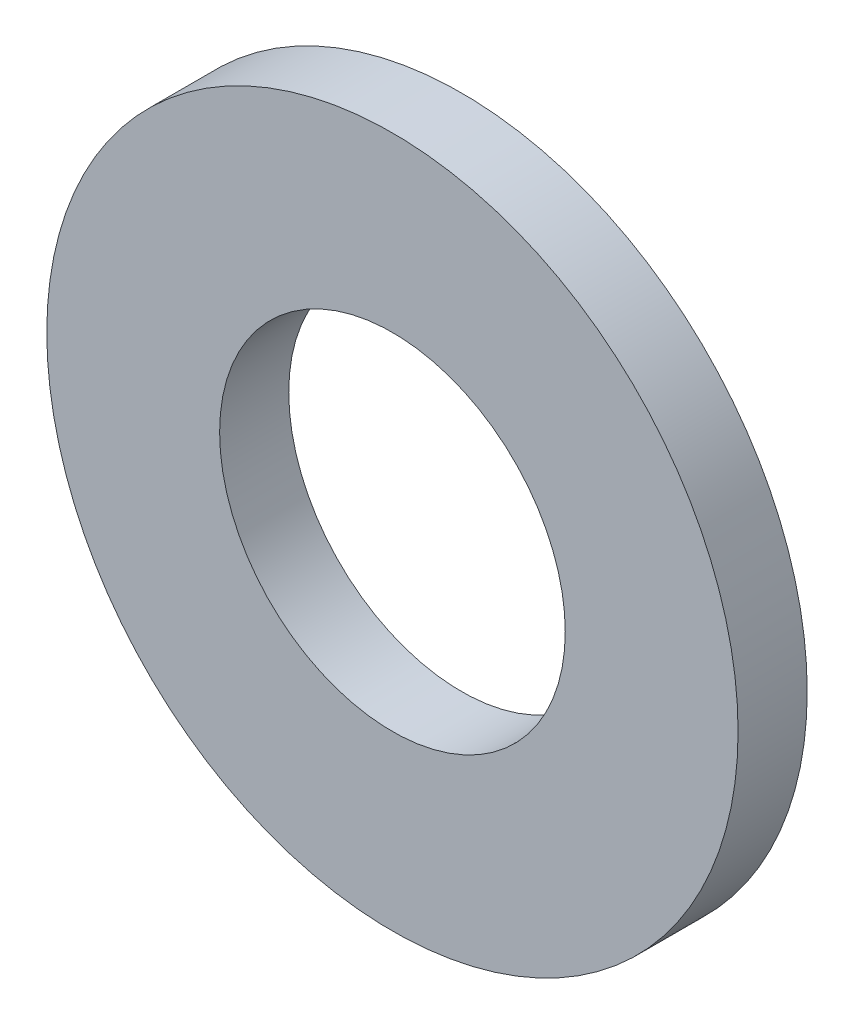
ISO-10303-21;
HEADER;
FILE_DESCRIPTION(('STEP AP214'),'2;1');
FILE_NAME('part.step','',(''),(''),'','','');
FILE_SCHEMA(('AUTOMOTIVE_DESIGN { 1 0 10303 214 1 1 1 1 }'));
ENDSEC;
DATA;
#1=APPLICATION_CONTEXT('core data for automotive mechanical design processes');
#2=APPLICATION_PROTOCOL_DEFINITION('international standard','automotive_design',2000,#1);
#3=PRODUCT_CONTEXT('',#1,'mechanical');
#4=PRODUCT('Part','Part','',(#3));
#5=PRODUCT_RELATED_PRODUCT_CATEGORY('part','',(#4));
#6=PRODUCT_DEFINITION_FORMATION('','',#4);
#7=PRODUCT_DEFINITION_CONTEXT('part definition',#1,'design');
#8=PRODUCT_DEFINITION('design','',#6,#7);
#9=PRODUCT_DEFINITION_SHAPE('','',#8);
#10=(LENGTH_UNIT() NAMED_UNIT(*) SI_UNIT(.MILLI.,.METRE.));
#11=(NAMED_UNIT(*) PLANE_ANGLE_UNIT() SI_UNIT($,.RADIAN.));
#12=(NAMED_UNIT(*) SI_UNIT($,.STERADIAN.) SOLID_ANGLE_UNIT());
#13=UNCERTAINTY_MEASURE_WITH_UNIT(LENGTH_MEASURE(1.E-05),#10,'distance_accuracy_value','');
#14=(GEOMETRIC_REPRESENTATION_CONTEXT(3) GLOBAL_UNCERTAINTY_ASSIGNED_CONTEXT((#13)) GLOBAL_UNIT_ASSIGNED_CONTEXT((#10,
#11,#12)) REPRESENTATION_CONTEXT('',''));
#15=CARTESIAN_POINT('',(0.,0.,0.));
#16=DIRECTION('',(0.,0.,1.));
#17=DIRECTION('',(1.,0.,0.));
#18=AXIS2_PLACEMENT_3D('',#15,#16,#17);
#19=CARTESIAN_POINT('',(0.,0.,1.6));
#20=DIRECTION('',(0.,0.,1.));
#21=DIRECTION('',(1.,0.,0.));
#22=AXIS2_PLACEMENT_3D('',#19,#20,#21);
#23=PLANE('',#22);
#24=CARTESIAN_POINT('',(0.,0.,1.6));
#25=DIRECTION('',(0.,0.,1.));
#26=DIRECTION('',(1.,0.,0.));
#27=AXIS2_PLACEMENT_3D('',#24,#25,#26);
#28=CIRCLE('',#27,8.);
#29=CARTESIAN_POINT('',(8.,0.,1.6));
#30=VERTEX_POINT('',#29);
#31=EDGE_CURVE('E10',#30,#30,#28,.T.);
#32=ORIENTED_EDGE('',*,*,#31,.T.);
#33=EDGE_LOOP('',(#32));
#34=FACE_BOUND('',#33,.T.);
#35=CARTESIAN_POINT('',(0.,0.,1.6));
#36=DIRECTION('',(0.,0.,1.));
#37=DIRECTION('',(1.,0.,0.));
#38=AXIS2_PLACEMENT_3D('',#35,#36,#37);
#39=CIRCLE('',#38,4.);
#40=CARTESIAN_POINT('',(4.,0.,1.6));
#41=VERTEX_POINT('',#40);
#42=EDGE_CURVE('E42',#41,#41,#39,.T.);
#43=ORIENTED_EDGE('',*,*,#42,.F.);
#44=EDGE_LOOP('',(#43));
#45=FACE_BOUND('',#44,.T.);
#46=ADVANCED_FACE('F31',(#34,#45),#23,.T.);
#47=CARTESIAN_POINT('',(0.,0.,0.));
#48=DIRECTION('',(0.,0.,1.));
#49=DIRECTION('',(1.,0.,0.));
#50=AXIS2_PLACEMENT_3D('',#47,#48,#49);
#51=PLANE('',#50);
#52=CARTESIAN_POINT('',(0.,0.,0.));
#53=DIRECTION('',(0.,0.,1.));
#54=DIRECTION('',(1.,0.,0.));
#55=AXIS2_PLACEMENT_3D('',#52,#53,#54);
#56=CIRCLE('',#55,8.);
#57=CARTESIAN_POINT('',(8.,0.,0.));
#58=VERTEX_POINT('',#57);
#59=EDGE_CURVE('E35',#58,#58,#56,.T.);
#60=ORIENTED_EDGE('',*,*,#59,.F.);
#61=EDGE_LOOP('',(#60));
#62=FACE_BOUND('',#61,.T.);
#63=CARTESIAN_POINT('',(0.,0.,0.));
#64=DIRECTION('',(0.,0.,1.));
#65=DIRECTION('',(1.,0.,0.));
#66=AXIS2_PLACEMENT_3D('',#63,#64,#65);
#67=CIRCLE('',#66,4.);
#68=CARTESIAN_POINT('',(4.,0.,0.));
#69=VERTEX_POINT('',#68);
#70=EDGE_CURVE('E44',#69,#69,#67,.T.);
#71=ORIENTED_EDGE('',*,*,#70,.T.);
#72=EDGE_LOOP('',(#71));
#73=FACE_BOUND('',#72,.T.);
#74=ADVANCED_FACE('F54',(#62,#73),#51,.F.);
#75=CARTESIAN_POINT('',(0.,0.,1.6));
#76=DIRECTION('',(0.,0.,-1.));
#77=DIRECTION('',(-1.,0.,0.));
#78=AXIS2_PLACEMENT_3D('',#75,#76,#77);
#79=CYLINDRICAL_SURFACE('',#78,8.);
#80=ORIENTED_EDGE('',*,*,#31,.F.);
#81=EDGE_LOOP('',(#80));
#82=FACE_BOUND('',#81,.T.);
#83=ORIENTED_EDGE('',*,*,#59,.T.);
#84=EDGE_LOOP('',(#83));
#85=FACE_BOUND('',#84,.T.);
#86=ADVANCED_FACE('F33',(#82,#85),#79,.T.);
#87=CARTESIAN_POINT('',(0.,0.,1.6));
#88=DIRECTION('',(0.,0.,-1.));
#89=DIRECTION('',(-1.,0.,0.));
#90=AXIS2_PLACEMENT_3D('',#87,#88,#89);
#91=CYLINDRICAL_SURFACE('',#90,4.);
#92=ORIENTED_EDGE('',*,*,#42,.T.);
#93=EDGE_LOOP('',(#92));
#94=FACE_BOUND('',#93,.T.);
#95=ORIENTED_EDGE('',*,*,#70,.F.);
#96=EDGE_LOOP('',(#95));
#97=FACE_BOUND('',#96,.T.);
#98=ADVANCED_FACE('F50',(#94,#97),#91,.F.);
#99=CLOSED_SHELL('',(#46,#74,#86,#98));
#100=MANIFOLD_SOLID_BREP('B2',#99);
#101=ADVANCED_BREP_SHAPE_REPRESENTATION('',(#18,#100),#14);
#102=SHAPE_DEFINITION_REPRESENTATION(#9,#101);
ENDSEC;
END-ISO-10303-21;
